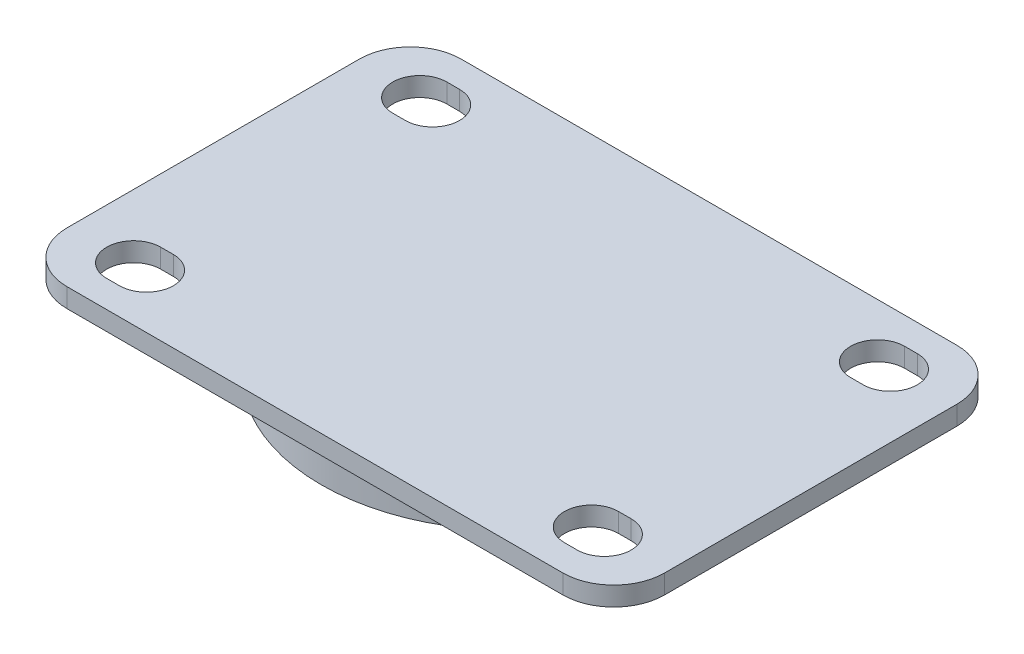
ISO-10303-21;
HEADER;
FILE_DESCRIPTION(('STEP AP214'),'2;1');
FILE_NAME('part.step','',(''),(''),'','','');
FILE_SCHEMA(('AUTOMOTIVE_DESIGN { 1 0 10303 214 1 1 1 1 }'));
ENDSEC;
DATA;
#1=APPLICATION_CONTEXT('core data for automotive mechanical design processes');
#2=APPLICATION_PROTOCOL_DEFINITION('international standard','automotive_design',2000,#1);
#3=PRODUCT_CONTEXT('',#1,'mechanical');
#4=PRODUCT('Part','Part','',(#3));
#5=PRODUCT_RELATED_PRODUCT_CATEGORY('part','',(#4));
#6=PRODUCT_DEFINITION_FORMATION('','',#4);
#7=PRODUCT_DEFINITION_CONTEXT('part definition',#1,'design');
#8=PRODUCT_DEFINITION('design','',#6,#7);
#9=PRODUCT_DEFINITION_SHAPE('','',#8);
#10=(LENGTH_UNIT() NAMED_UNIT(*) SI_UNIT(.MILLI.,.METRE.));
#11=(NAMED_UNIT(*) PLANE_ANGLE_UNIT() SI_UNIT($,.RADIAN.));
#12=(NAMED_UNIT(*) SI_UNIT($,.STERADIAN.) SOLID_ANGLE_UNIT());
#13=UNCERTAINTY_MEASURE_WITH_UNIT(LENGTH_MEASURE(1.E-05),#10,'distance_accuracy_value','');
#14=(GEOMETRIC_REPRESENTATION_CONTEXT(3) GLOBAL_UNCERTAINTY_ASSIGNED_CONTEXT((#13)) GLOBAL_UNIT_ASSIGNED_CONTEXT((#10,
#11,#12)) REPRESENTATION_CONTEXT('',''));
#15=CARTESIAN_POINT('',(0.,0.,0.));
#16=DIRECTION('',(0.,0.,1.));
#17=DIRECTION('',(1.,0.,0.));
#18=AXIS2_PLACEMENT_3D('',#15,#16,#17);
#19=CARTESIAN_POINT('',(0.,3.,0.));
#20=DIRECTION('',(0.,1.,0.));
#21=DIRECTION('',(0.,0.,1.));
#22=AXIS2_PLACEMENT_3D('',#19,#20,#21);
#23=PLANE('',#22);
#24=DIRECTION('',(0.,0.,1.));
#25=VECTOR('',#24,1.);
#26=CARTESIAN_POINT('',(-47.,3.,31.));
#27=LINE('',#26,#25);
#28=CARTESIAN_POINT('',(-47.,3.,-23.));
#29=VERTEX_POINT('',#28);
#30=CARTESIAN_POINT('',(-47.,3.,23.));
#31=VERTEX_POINT('',#30);
#32=EDGE_CURVE('E334',#29,#31,#27,.T.);
#33=ORIENTED_EDGE('',*,*,#32,.T.);
#34=CARTESIAN_POINT('',(-39.,3.,23.));
#35=DIRECTION('',(0.,1.,0.));
#36=DIRECTION('',(0.,0.,1.));
#37=AXIS2_PLACEMENT_3D('',#34,#35,#36);
#38=CIRCLE('',#37,8.);
#39=CARTESIAN_POINT('',(-39.,3.,31.));
#40=VERTEX_POINT('',#39);
#41=EDGE_CURVE('E377',#31,#40,#38,.T.);
#42=ORIENTED_EDGE('',*,*,#41,.T.);
#43=DIRECTION('',(1.,0.,0.));
#44=VECTOR('',#43,1.);
#45=CARTESIAN_POINT('',(47.,3.,31.));
#46=LINE('',#45,#44);
#47=CARTESIAN_POINT('',(39.,3.,31.));
#48=VERTEX_POINT('',#47);
#49=EDGE_CURVE('E337',#40,#48,#46,.T.);
#50=ORIENTED_EDGE('',*,*,#49,.T.);
#51=CARTESIAN_POINT('',(39.,3.,23.));
#52=DIRECTION('',(0.,1.,0.));
#53=DIRECTION('',(0.,0.,1.));
#54=AXIS2_PLACEMENT_3D('',#51,#52,#53);
#55=CIRCLE('',#54,8.);
#56=CARTESIAN_POINT('',(47.,3.,23.));
#57=VERTEX_POINT('',#56);
#58=EDGE_CURVE('E375',#48,#57,#55,.T.);
#59=ORIENTED_EDGE('',*,*,#58,.T.);
#60=DIRECTION('',(0.,0.,-1.));
#61=VECTOR('',#60,1.);
#62=CARTESIAN_POINT('',(47.,3.,31.));
#63=LINE('',#62,#61);
#64=CARTESIAN_POINT('',(47.,3.,-23.));
#65=VERTEX_POINT('',#64);
#66=EDGE_CURVE('E341',#57,#65,#63,.T.);
#67=ORIENTED_EDGE('',*,*,#66,.T.);
#68=CARTESIAN_POINT('',(39.,3.,-23.));
#69=DIRECTION('',(0.,1.,0.));
#70=DIRECTION('',(0.,0.,1.));
#71=AXIS2_PLACEMENT_3D('',#68,#69,#70);
#72=CIRCLE('',#71,8.);
#73=CARTESIAN_POINT('',(39.,3.,-31.));
#74=VERTEX_POINT('',#73);
#75=EDGE_CURVE('E56',#65,#74,#72,.T.);
#76=ORIENTED_EDGE('',*,*,#75,.T.);
#77=DIRECTION('',(-1.,0.,0.));
#78=VECTOR('',#77,1.);
#79=CARTESIAN_POINT('',(47.,3.,-31.));
#80=LINE('',#79,#78);
#81=CARTESIAN_POINT('',(-39.,3.,-31.));
#82=VERTEX_POINT('',#81);
#83=EDGE_CURVE('E343',#74,#82,#80,.T.);
#84=ORIENTED_EDGE('',*,*,#83,.T.);
#85=CARTESIAN_POINT('',(-39.,3.,-23.));
#86=DIRECTION('',(0.,1.,0.));
#87=DIRECTION('',(0.,0.,1.));
#88=AXIS2_PLACEMENT_3D('',#85,#86,#87);
#89=CIRCLE('',#88,8.);
#90=EDGE_CURVE('E372',#82,#29,#89,.T.);
#91=ORIENTED_EDGE('',*,*,#90,.T.);
#92=EDGE_LOOP('',(#33,#42,#50,#59,#67,#76,#84,#91));
#93=FACE_BOUND('',#92,.T.);
#94=DIRECTION('',(1.,0.,0.));
#95=VECTOR('',#94,1.);
#96=CARTESIAN_POINT('',(-37.,3.,-18.25));
#97=LINE('',#96,#95);
#98=CARTESIAN_POINT('',(-37.,3.,-18.25));
#99=VERTEX_POINT('',#98);
#100=CARTESIAN_POINT('',(-35.,3.,-18.25));
#101=VERTEX_POINT('',#100);
#102=EDGE_CURVE('E305',#99,#101,#97,.T.);
#103=ORIENTED_EDGE('',*,*,#102,.F.);
#104=CARTESIAN_POINT('',(-37.,3.,-22.5));
#105=DIRECTION('',(0.,1.,0.));
#106=DIRECTION('',(0.,0.,1.));
#107=AXIS2_PLACEMENT_3D('',#104,#105,#106);
#108=CIRCLE('',#107,4.25);
#109=CARTESIAN_POINT('',(-37.,3.,-26.75));
#110=VERTEX_POINT('',#109);
#111=EDGE_CURVE('E303',#110,#99,#108,.T.);
#112=ORIENTED_EDGE('',*,*,#111,.F.);
#113=DIRECTION('',(-1.,0.,0.));
#114=VECTOR('',#113,1.);
#115=CARTESIAN_POINT('',(-37.,3.,-26.75));
#116=LINE('',#115,#114);
#117=CARTESIAN_POINT('',(-35.,3.,-26.75));
#118=VERTEX_POINT('',#117);
#119=EDGE_CURVE('E311',#118,#110,#116,.T.);
#120=ORIENTED_EDGE('',*,*,#119,.F.);
#121=CARTESIAN_POINT('',(-35.,3.,-22.5));
#122=DIRECTION('',(0.,1.,0.));
#123=DIRECTION('',(0.,0.,1.));
#124=AXIS2_PLACEMENT_3D('',#121,#122,#123);
#125=CIRCLE('',#124,4.25);
#126=EDGE_CURVE('E308',#101,#118,#125,.T.);
#127=ORIENTED_EDGE('',*,*,#126,.F.);
#128=EDGE_LOOP('',(#103,#112,#120,#127));
#129=FACE_BOUND('',#128,.T.);
#130=DIRECTION('',(-1.,0.,0.));
#131=VECTOR('',#130,1.);
#132=CARTESIAN_POINT('',(37.,3.,-26.75));
#133=LINE('',#132,#131);
#134=CARTESIAN_POINT('',(37.,3.,-26.75));
#135=VERTEX_POINT('',#134);
#136=CARTESIAN_POINT('',(35.,3.,-26.75));
#137=VERTEX_POINT('',#136);
#138=EDGE_CURVE('E274',#135,#137,#133,.T.);
#139=ORIENTED_EDGE('',*,*,#138,.F.);
#140=CARTESIAN_POINT('',(37.,3.,-22.5));
#141=DIRECTION('',(0.,1.,0.));
#142=DIRECTION('',(0.,0.,-1.));
#143=AXIS2_PLACEMENT_3D('',#140,#141,#142);
#144=CIRCLE('',#143,4.24999999999999);
#145=CARTESIAN_POINT('',(37.,3.,-18.25));
#146=VERTEX_POINT('',#145);
#147=EDGE_CURVE('E272',#146,#135,#144,.T.);
#148=ORIENTED_EDGE('',*,*,#147,.F.);
#149=DIRECTION('',(1.,0.,0.));
#150=VECTOR('',#149,1.);
#151=CARTESIAN_POINT('',(37.,3.,-18.25));
#152=LINE('',#151,#150);
#153=CARTESIAN_POINT('',(35.,3.,-18.25));
#154=VERTEX_POINT('',#153);
#155=EDGE_CURVE('E280',#154,#146,#152,.T.);
#156=ORIENTED_EDGE('',*,*,#155,.F.);
#157=CARTESIAN_POINT('',(35.,3.,-22.5));
#158=DIRECTION('',(0.,1.,0.));
#159=DIRECTION('',(0.,0.,-1.));
#160=AXIS2_PLACEMENT_3D('',#157,#158,#159);
#161=CIRCLE('',#160,4.25);
#162=EDGE_CURVE('E277',#137,#154,#161,.T.);
#163=ORIENTED_EDGE('',*,*,#162,.F.);
#164=EDGE_LOOP('',(#139,#148,#156,#163));
#165=FACE_BOUND('',#164,.T.);
#166=DIRECTION('',(-1.,0.,0.));
#167=VECTOR('',#166,1.);
#168=CARTESIAN_POINT('',(37.,3.,18.25));
#169=LINE('',#168,#167);
#170=CARTESIAN_POINT('',(37.,3.,18.25));
#171=VERTEX_POINT('',#170);
#172=CARTESIAN_POINT('',(35.,3.,18.25));
#173=VERTEX_POINT('',#172);
#174=EDGE_CURVE('E243',#171,#173,#169,.T.);
#175=ORIENTED_EDGE('',*,*,#174,.F.);
#176=CARTESIAN_POINT('',(37.,3.,22.5));
#177=DIRECTION('',(0.,1.,0.));
#178=DIRECTION('',(0.,0.,1.));
#179=AXIS2_PLACEMENT_3D('',#176,#177,#178);
#180=CIRCLE('',#179,4.25);
#181=CARTESIAN_POINT('',(37.,3.,26.75));
#182=VERTEX_POINT('',#181);
#183=EDGE_CURVE('E241',#182,#171,#180,.T.);
#184=ORIENTED_EDGE('',*,*,#183,.F.);
#185=DIRECTION('',(1.,0.,0.));
#186=VECTOR('',#185,1.);
#187=CARTESIAN_POINT('',(37.,3.,26.75));
#188=LINE('',#187,#186);
#189=CARTESIAN_POINT('',(35.,3.,26.75));
#190=VERTEX_POINT('',#189);
#191=EDGE_CURVE('E249',#190,#182,#188,.T.);
#192=ORIENTED_EDGE('',*,*,#191,.F.);
#193=CARTESIAN_POINT('',(35.,3.,22.5));
#194=DIRECTION('',(0.,1.,0.));
#195=DIRECTION('',(0.,0.,1.));
#196=AXIS2_PLACEMENT_3D('',#193,#194,#195);
#197=CIRCLE('',#196,4.24999999999999);
#198=EDGE_CURVE('E246',#173,#190,#197,.T.);
#199=ORIENTED_EDGE('',*,*,#198,.F.);
#200=EDGE_LOOP('',(#175,#184,#192,#199));
#201=FACE_BOUND('',#200,.T.);
#202=DIRECTION('',(1.,0.,0.));
#203=VECTOR('',#202,1.);
#204=CARTESIAN_POINT('',(-37.,3.,26.75));
#205=LINE('',#204,#203);
#206=CARTESIAN_POINT('',(-37.,3.,26.75));
#207=VERTEX_POINT('',#206);
#208=CARTESIAN_POINT('',(-35.,3.,26.75));
#209=VERTEX_POINT('',#208);
#210=EDGE_CURVE('E208',#207,#209,#205,.T.);
#211=ORIENTED_EDGE('',*,*,#210,.F.);
#212=CARTESIAN_POINT('',(-37.,3.,22.5));
#213=DIRECTION('',(0.,1.,0.));
#214=DIRECTION('',(0.,0.,-1.));
#215=AXIS2_PLACEMENT_3D('',#212,#213,#214);
#216=CIRCLE('',#215,4.25);
#217=CARTESIAN_POINT('',(-37.,3.,18.25));
#218=VERTEX_POINT('',#217);
#219=EDGE_CURVE('E198',#218,#207,#216,.T.);
#220=ORIENTED_EDGE('',*,*,#219,.F.);
#221=DIRECTION('',(-1.,0.,0.));
#222=VECTOR('',#221,1.);
#223=CARTESIAN_POINT('',(-37.,3.,18.25));
#224=LINE('',#223,#222);
#225=CARTESIAN_POINT('',(-35.,3.,18.25));
#226=VERTEX_POINT('',#225);
#227=EDGE_CURVE('E223',#226,#218,#224,.T.);
#228=ORIENTED_EDGE('',*,*,#227,.F.);
#229=CARTESIAN_POINT('',(-35.,3.,22.5));
#230=DIRECTION('',(0.,1.,0.));
#231=DIRECTION('',(0.,0.,-1.));
#232=AXIS2_PLACEMENT_3D('',#229,#230,#231);
#233=CIRCLE('',#232,4.25);
#234=EDGE_CURVE('E221',#209,#226,#233,.T.);
#235=ORIENTED_EDGE('',*,*,#234,.F.);
#236=EDGE_LOOP('',(#211,#220,#228,#235));
#237=FACE_BOUND('',#236,.T.);
#238=ADVANCED_FACE('F34',(#93,#129,#165,#201,#237),#23,.T.);
#239=CARTESIAN_POINT('',(0.,0.,0.));
#240=DIRECTION('',(0.,1.,0.));
#241=DIRECTION('',(0.,0.,1.));
#242=AXIS2_PLACEMENT_3D('',#239,#240,#241);
#243=PLANE('',#242);
#244=CARTESIAN_POINT('',(0.,0.,0.));
#245=DIRECTION('',(0.,1.,0.));
#246=DIRECTION('',(0.,0.,1.));
#247=AXIS2_PLACEMENT_3D('',#244,#245,#246);
#248=CIRCLE('',#247,30.);
#249=CARTESIAN_POINT('',(0.,0.,30.));
#250=VERTEX_POINT('',#249);
#251=EDGE_CURVE('E11',#250,#250,#248,.F.);
#252=ORIENTED_EDGE('',*,*,#251,.F.);
#253=EDGE_LOOP('',(#252));
#254=FACE_BOUND('',#253,.T.);
#255=CARTESIAN_POINT('',(37.,0.,22.5));
#256=DIRECTION('',(0.,1.,0.));
#257=DIRECTION('',(0.,0.,1.));
#258=AXIS2_PLACEMENT_3D('',#255,#256,#257);
#259=CIRCLE('',#258,4.25);
#260=CARTESIAN_POINT('',(37.,0.,26.75));
#261=VERTEX_POINT('',#260);
#262=CARTESIAN_POINT('',(37.,0.,18.25));
#263=VERTEX_POINT('',#262);
#264=EDGE_CURVE('E216',#261,#263,#259,.T.);
#265=ORIENTED_EDGE('',*,*,#264,.T.);
#266=DIRECTION('',(-1.,0.,0.));
#267=VECTOR('',#266,1.);
#268=CARTESIAN_POINT('',(37.,0.,18.25));
#269=LINE('',#268,#267);
#270=CARTESIAN_POINT('',(35.,0.,18.25));
#271=VERTEX_POINT('',#270);
#272=EDGE_CURVE('E254',#263,#271,#269,.T.);
#273=ORIENTED_EDGE('',*,*,#272,.T.);
#274=CARTESIAN_POINT('',(35.,0.,22.5));
#275=DIRECTION('',(0.,1.,0.));
#276=DIRECTION('',(0.,0.,1.));
#277=AXIS2_PLACEMENT_3D('',#274,#275,#276);
#278=CIRCLE('',#277,4.24999999999999);
#279=CARTESIAN_POINT('',(35.,0.,26.75));
#280=VERTEX_POINT('',#279);
#281=EDGE_CURVE('E257',#271,#280,#278,.T.);
#282=ORIENTED_EDGE('',*,*,#281,.T.);
#283=DIRECTION('',(1.,0.,0.));
#284=VECTOR('',#283,1.);
#285=CARTESIAN_POINT('',(37.,0.,26.75));
#286=LINE('',#285,#284);
#287=EDGE_CURVE('E244',#280,#261,#286,.T.);
#288=ORIENTED_EDGE('',*,*,#287,.T.);
#289=EDGE_LOOP('',(#265,#273,#282,#288));
#290=FACE_BOUND('',#289,.T.);
#291=CARTESIAN_POINT('',(-37.,0.,-22.5));
#292=DIRECTION('',(0.,1.,0.));
#293=DIRECTION('',(0.,0.,1.));
#294=AXIS2_PLACEMENT_3D('',#291,#292,#293);
#295=CIRCLE('',#294,4.25);
#296=CARTESIAN_POINT('',(-37.,0.,-26.75));
#297=VERTEX_POINT('',#296);
#298=CARTESIAN_POINT('',(-37.,0.,-18.25));
#299=VERTEX_POINT('',#298);
#300=EDGE_CURVE('E302',#297,#299,#295,.T.);
#301=ORIENTED_EDGE('',*,*,#300,.T.);
#302=DIRECTION('',(1.,0.,0.));
#303=VECTOR('',#302,1.);
#304=CARTESIAN_POINT('',(-37.,0.,-18.25));
#305=LINE('',#304,#303);
#306=CARTESIAN_POINT('',(-35.,0.,-18.25));
#307=VERTEX_POINT('',#306);
#308=EDGE_CURVE('E316',#299,#307,#305,.T.);
#309=ORIENTED_EDGE('',*,*,#308,.T.);
#310=CARTESIAN_POINT('',(-35.,0.,-22.5));
#311=DIRECTION('',(0.,1.,0.));
#312=DIRECTION('',(0.,0.,1.));
#313=AXIS2_PLACEMENT_3D('',#310,#311,#312);
#314=CIRCLE('',#313,4.25);
#315=CARTESIAN_POINT('',(-35.,0.,-26.75));
#316=VERTEX_POINT('',#315);
#317=EDGE_CURVE('E319',#307,#316,#314,.T.);
#318=ORIENTED_EDGE('',*,*,#317,.T.);
#319=DIRECTION('',(-1.,0.,0.));
#320=VECTOR('',#319,1.);
#321=CARTESIAN_POINT('',(-37.,0.,-26.75));
#322=LINE('',#321,#320);
#323=EDGE_CURVE('E306',#316,#297,#322,.T.);
#324=ORIENTED_EDGE('',*,*,#323,.T.);
#325=EDGE_LOOP('',(#301,#309,#318,#324));
#326=FACE_BOUND('',#325,.T.);
#327=DIRECTION('',(1.,0.,0.));
#328=VECTOR('',#327,1.);
#329=CARTESIAN_POINT('',(47.,0.,31.));
#330=LINE('',#329,#328);
#331=CARTESIAN_POINT('',(-39.,0.,31.));
#332=VERTEX_POINT('',#331);
#333=CARTESIAN_POINT('',(39.,0.,31.));
#334=VERTEX_POINT('',#333);
#335=EDGE_CURVE('E348',#332,#334,#330,.T.);
#336=ORIENTED_EDGE('',*,*,#335,.F.);
#337=CARTESIAN_POINT('',(-39.,0.,23.));
#338=DIRECTION('',(0.,1.,0.));
#339=DIRECTION('',(0.,0.,1.));
#340=AXIS2_PLACEMENT_3D('',#337,#338,#339);
#341=CIRCLE('',#340,8.);
#342=CARTESIAN_POINT('',(-47.,0.,23.));
#343=VERTEX_POINT('',#342);
#344=EDGE_CURVE('E365',#332,#343,#341,.F.);
#345=ORIENTED_EDGE('',*,*,#344,.T.);
#346=DIRECTION('',(0.,0.,1.));
#347=VECTOR('',#346,1.);
#348=CARTESIAN_POINT('',(-47.,0.,31.));
#349=LINE('',#348,#347);
#350=CARTESIAN_POINT('',(-47.,0.,-23.));
#351=VERTEX_POINT('',#350);
#352=EDGE_CURVE('E333',#351,#343,#349,.T.);
#353=ORIENTED_EDGE('',*,*,#352,.F.);
#354=CARTESIAN_POINT('',(-39.,0.,-23.));
#355=DIRECTION('',(0.,1.,0.));
#356=DIRECTION('',(0.,0.,1.));
#357=AXIS2_PLACEMENT_3D('',#354,#355,#356);
#358=CIRCLE('',#357,8.);
#359=CARTESIAN_POINT('',(-39.,0.,-31.));
#360=VERTEX_POINT('',#359);
#361=EDGE_CURVE('E359',#351,#360,#358,.F.);
#362=ORIENTED_EDGE('',*,*,#361,.T.);
#363=DIRECTION('',(-1.,0.,0.));
#364=VECTOR('',#363,1.);
#365=CARTESIAN_POINT('',(47.,0.,-31.));
#366=LINE('',#365,#364);
#367=CARTESIAN_POINT('',(39.,0.,-31.));
#368=VERTEX_POINT('',#367);
#369=EDGE_CURVE('E338',#368,#360,#366,.T.);
#370=ORIENTED_EDGE('',*,*,#369,.F.);
#371=CARTESIAN_POINT('',(39.,0.,-23.));
#372=DIRECTION('',(0.,1.,0.));
#373=DIRECTION('',(0.,0.,1.));
#374=AXIS2_PLACEMENT_3D('',#371,#372,#373);
#375=CIRCLE('',#374,8.);
#376=CARTESIAN_POINT('',(47.,0.,-23.));
#377=VERTEX_POINT('',#376);
#378=EDGE_CURVE('E361',#368,#377,#375,.F.);
#379=ORIENTED_EDGE('',*,*,#378,.T.);
#380=DIRECTION('',(0.,0.,-1.));
#381=VECTOR('',#380,1.);
#382=CARTESIAN_POINT('',(47.,0.,31.));
#383=LINE('',#382,#381);
#384=CARTESIAN_POINT('',(47.,0.,23.));
#385=VERTEX_POINT('',#384);
#386=EDGE_CURVE('E351',#385,#377,#383,.T.);
#387=ORIENTED_EDGE('',*,*,#386,.F.);
#388=CARTESIAN_POINT('',(39.,0.,23.));
#389=DIRECTION('',(0.,1.,0.));
#390=DIRECTION('',(0.,0.,1.));
#391=AXIS2_PLACEMENT_3D('',#388,#389,#390);
#392=CIRCLE('',#391,8.);
#393=EDGE_CURVE('E363',#385,#334,#392,.F.);
#394=ORIENTED_EDGE('',*,*,#393,.T.);
#395=EDGE_LOOP('',(#336,#345,#353,#362,#370,#379,#387,#394));
#396=FACE_BOUND('',#395,.T.);
#397=CARTESIAN_POINT('',(37.,0.,-22.5));
#398=DIRECTION('',(0.,1.,0.));
#399=DIRECTION('',(0.,0.,-1.));
#400=AXIS2_PLACEMENT_3D('',#397,#398,#399);
#401=CIRCLE('',#400,4.24999999999999);
#402=CARTESIAN_POINT('',(37.,0.,-18.25));
#403=VERTEX_POINT('',#402);
#404=CARTESIAN_POINT('',(37.,0.,-26.75));
#405=VERTEX_POINT('',#404);
#406=EDGE_CURVE('E271',#403,#405,#401,.T.);
#407=ORIENTED_EDGE('',*,*,#406,.T.);
#408=DIRECTION('',(-1.,0.,0.));
#409=VECTOR('',#408,1.);
#410=CARTESIAN_POINT('',(37.,0.,-26.75));
#411=LINE('',#410,#409);
#412=CARTESIAN_POINT('',(35.,0.,-26.75));
#413=VERTEX_POINT('',#412);
#414=EDGE_CURVE('E285',#405,#413,#411,.T.);
#415=ORIENTED_EDGE('',*,*,#414,.T.);
#416=CARTESIAN_POINT('',(35.,0.,-22.5));
#417=DIRECTION('',(0.,1.,0.));
#418=DIRECTION('',(0.,0.,-1.));
#419=AXIS2_PLACEMENT_3D('',#416,#417,#418);
#420=CIRCLE('',#419,4.25);
#421=CARTESIAN_POINT('',(35.,0.,-18.25));
#422=VERTEX_POINT('',#421);
#423=EDGE_CURVE('E288',#413,#422,#420,.T.);
#424=ORIENTED_EDGE('',*,*,#423,.T.);
#425=DIRECTION('',(1.,0.,0.));
#426=VECTOR('',#425,1.);
#427=CARTESIAN_POINT('',(37.,0.,-18.25));
#428=LINE('',#427,#426);
#429=EDGE_CURVE('E275',#422,#403,#428,.T.);
#430=ORIENTED_EDGE('',*,*,#429,.T.);
#431=EDGE_LOOP('',(#407,#415,#424,#430));
#432=FACE_BOUND('',#431,.T.);
#433=CARTESIAN_POINT('',(-37.,0.,22.5));
#434=DIRECTION('',(0.,1.,0.));
#435=DIRECTION('',(0.,0.,-1.));
#436=AXIS2_PLACEMENT_3D('',#433,#434,#435);
#437=CIRCLE('',#436,4.25);
#438=CARTESIAN_POINT('',(-37.,0.,18.25));
#439=VERTEX_POINT('',#438);
#440=CARTESIAN_POINT('',(-37.,0.,26.75));
#441=VERTEX_POINT('',#440);
#442=EDGE_CURVE('E228',#439,#441,#437,.T.);
#443=ORIENTED_EDGE('',*,*,#442,.T.);
#444=DIRECTION('',(1.,0.,0.));
#445=VECTOR('',#444,1.);
#446=CARTESIAN_POINT('',(-37.,0.,26.75));
#447=LINE('',#446,#445);
#448=CARTESIAN_POINT('',(-35.,0.,26.75));
#449=VERTEX_POINT('',#448);
#450=EDGE_CURVE('E215',#441,#449,#447,.T.);
#451=ORIENTED_EDGE('',*,*,#450,.T.);
#452=CARTESIAN_POINT('',(-35.,0.,22.5));
#453=DIRECTION('',(0.,1.,0.));
#454=DIRECTION('',(0.,0.,-1.));
#455=AXIS2_PLACEMENT_3D('',#452,#453,#454);
#456=CIRCLE('',#455,4.25);
#457=CARTESIAN_POINT('',(-35.,0.,18.25));
#458=VERTEX_POINT('',#457);
#459=EDGE_CURVE('E232',#449,#458,#456,.T.);
#460=ORIENTED_EDGE('',*,*,#459,.T.);
#461=DIRECTION('',(-1.,0.,0.));
#462=VECTOR('',#461,1.);
#463=CARTESIAN_POINT('',(-37.,0.,18.25));
#464=LINE('',#463,#462);
#465=EDGE_CURVE('E209',#458,#439,#464,.T.);
#466=ORIENTED_EDGE('',*,*,#465,.T.);
#467=EDGE_LOOP('',(#443,#451,#460,#466));
#468=FACE_BOUND('',#467,.T.);
#469=ADVANCED_FACE('F391',(#254,#290,#326,#396,#432,#468),#243,.F.);
#470=CARTESIAN_POINT('',(-47.,3.,31.));
#471=DIRECTION('',(1.,0.,0.));
#472=DIRECTION('',(0.,0.,-1.));
#473=AXIS2_PLACEMENT_3D('',#470,#471,#472);
#474=PLANE('',#473);
#475=ORIENTED_EDGE('',*,*,#352,.T.);
#476=DIRECTION('',(0.,-1.,0.));
#477=VECTOR('',#476,1.);
#478=CARTESIAN_POINT('',(-47.,3.,23.));
#479=LINE('',#478,#477);
#480=EDGE_CURVE('E370',#343,#31,#479,.F.);
#481=ORIENTED_EDGE('',*,*,#480,.T.);
#482=ORIENTED_EDGE('',*,*,#32,.F.);
#483=DIRECTION('',(0.,-1.,0.));
#484=VECTOR('',#483,1.);
#485=CARTESIAN_POINT('',(-47.,3.,-23.));
#486=LINE('',#485,#484);
#487=EDGE_CURVE('E367',#29,#351,#486,.T.);
#488=ORIENTED_EDGE('',*,*,#487,.T.);
#489=EDGE_LOOP('',(#475,#481,#482,#488));
#490=FACE_BOUND('',#489,.T.);
#491=ADVANCED_FACE('F400',(#490),#474,.F.);
#492=CARTESIAN_POINT('',(47.,3.,31.));
#493=DIRECTION('',(0.,0.,-1.));
#494=DIRECTION('',(-1.,0.,0.));
#495=AXIS2_PLACEMENT_3D('',#492,#493,#494);
#496=PLANE('',#495);
#497=ORIENTED_EDGE('',*,*,#49,.F.);
#498=DIRECTION('',(0.,-1.,0.));
#499=VECTOR('',#498,1.);
#500=CARTESIAN_POINT('',(-39.,3.,31.));
#501=LINE('',#500,#499);
#502=EDGE_CURVE('E356',#40,#332,#501,.T.);
#503=ORIENTED_EDGE('',*,*,#502,.T.);
#504=ORIENTED_EDGE('',*,*,#335,.T.);
#505=DIRECTION('',(0.,-1.,0.));
#506=VECTOR('',#505,1.);
#507=CARTESIAN_POINT('',(39.,3.,31.));
#508=LINE('',#507,#506);
#509=EDGE_CURVE('E345',#334,#48,#508,.F.);
#510=ORIENTED_EDGE('',*,*,#509,.T.);
#511=EDGE_LOOP('',(#497,#503,#504,#510));
#512=FACE_BOUND('',#511,.T.);
#513=ADVANCED_FACE('F409',(#512),#496,.F.);
#514=CARTESIAN_POINT('',(47.,3.,31.));
#515=DIRECTION('',(-1.,0.,0.));
#516=DIRECTION('',(0.,0.,1.));
#517=AXIS2_PLACEMENT_3D('',#514,#515,#516);
#518=PLANE('',#517);
#519=ORIENTED_EDGE('',*,*,#66,.F.);
#520=DIRECTION('',(0.,-1.,0.));
#521=VECTOR('',#520,1.);
#522=CARTESIAN_POINT('',(47.,3.,23.));
#523=LINE('',#522,#521);
#524=EDGE_CURVE('E381',#57,#385,#523,.T.);
#525=ORIENTED_EDGE('',*,*,#524,.T.);
#526=ORIENTED_EDGE('',*,*,#386,.T.);
#527=DIRECTION('',(0.,-1.,0.));
#528=VECTOR('',#527,1.);
#529=CARTESIAN_POINT('',(47.,3.,-23.));
#530=LINE('',#529,#528);
#531=EDGE_CURVE('E379',#377,#65,#530,.F.);
#532=ORIENTED_EDGE('',*,*,#531,.T.);
#533=EDGE_LOOP('',(#519,#525,#526,#532));
#534=FACE_BOUND('',#533,.T.);
#535=ADVANCED_FACE('F417',(#534),#518,.F.);
#536=CARTESIAN_POINT('',(47.,3.,-31.));
#537=DIRECTION('',(0.,0.,1.));
#538=DIRECTION('',(1.,0.,0.));
#539=AXIS2_PLACEMENT_3D('',#536,#537,#538);
#540=PLANE('',#539);
#541=ORIENTED_EDGE('',*,*,#83,.F.);
#542=DIRECTION('',(0.,-1.,0.));
#543=VECTOR('',#542,1.);
#544=CARTESIAN_POINT('',(39.,3.,-31.));
#545=LINE('',#544,#543);
#546=EDGE_CURVE('E42',#74,#368,#545,.T.);
#547=ORIENTED_EDGE('',*,*,#546,.T.);
#548=ORIENTED_EDGE('',*,*,#369,.T.);
#549=DIRECTION('',(0.,-1.,0.));
#550=VECTOR('',#549,1.);
#551=CARTESIAN_POINT('',(-39.,3.,-31.));
#552=LINE('',#551,#550);
#553=EDGE_CURVE('E49',#360,#82,#552,.F.);
#554=ORIENTED_EDGE('',*,*,#553,.T.);
#555=EDGE_LOOP('',(#541,#547,#548,#554));
#556=FACE_BOUND('',#555,.T.);
#557=ADVANCED_FACE('F387',(#556),#540,.F.);
#558=CARTESIAN_POINT('',(-37.,3.,-22.5));
#559=DIRECTION('',(0.,-1.,0.));
#560=DIRECTION('',(0.,0.,-1.));
#561=AXIS2_PLACEMENT_3D('',#558,#559,#560);
#562=CYLINDRICAL_SURFACE('',#561,4.25);
#563=ORIENTED_EDGE('',*,*,#300,.F.);
#564=DIRECTION('',(0.,-1.,0.));
#565=VECTOR('',#564,1.);
#566=CARTESIAN_POINT('',(-37.,3.,-26.75));
#567=LINE('',#566,#565);
#568=EDGE_CURVE('E313',#110,#297,#567,.T.);
#569=ORIENTED_EDGE('',*,*,#568,.F.);
#570=ORIENTED_EDGE('',*,*,#111,.T.);
#571=DIRECTION('',(0.,-1.,0.));
#572=VECTOR('',#571,1.);
#573=CARTESIAN_POINT('',(-37.,3.,-18.25));
#574=LINE('',#573,#572);
#575=EDGE_CURVE('E330',#99,#299,#574,.T.);
#576=ORIENTED_EDGE('',*,*,#575,.T.);
#577=EDGE_LOOP('',(#563,#569,#570,#576));
#578=FACE_BOUND('',#577,.T.);
#579=ADVANCED_FACE('F435',(#578),#562,.F.);
#580=CARTESIAN_POINT('',(-37.,3.,-18.25));
#581=DIRECTION('',(0.,0.,-1.));
#582=DIRECTION('',(-1.,0.,0.));
#583=AXIS2_PLACEMENT_3D('',#580,#581,#582);
#584=PLANE('',#583);
#585=ORIENTED_EDGE('',*,*,#308,.F.);
#586=ORIENTED_EDGE('',*,*,#575,.F.);
#587=ORIENTED_EDGE('',*,*,#102,.T.);
#588=DIRECTION('',(0.,-1.,0.));
#589=VECTOR('',#588,1.);
#590=CARTESIAN_POINT('',(-35.,3.,-18.25));
#591=LINE('',#590,#589);
#592=EDGE_CURVE('E328',#101,#307,#591,.T.);
#593=ORIENTED_EDGE('',*,*,#592,.T.);
#594=EDGE_LOOP('',(#585,#586,#587,#593));
#595=FACE_BOUND('',#594,.T.);
#596=ADVANCED_FACE('F505',(#595),#584,.T.);
#597=CARTESIAN_POINT('',(-35.,3.,-22.5));
#598=DIRECTION('',(0.,-1.,0.));
#599=DIRECTION('',(0.,0.,-1.));
#600=AXIS2_PLACEMENT_3D('',#597,#598,#599);
#601=CYLINDRICAL_SURFACE('',#600,4.25);
#602=ORIENTED_EDGE('',*,*,#317,.F.);
#603=ORIENTED_EDGE('',*,*,#592,.F.);
#604=ORIENTED_EDGE('',*,*,#126,.T.);
#605=DIRECTION('',(0.,-1.,0.));
#606=VECTOR('',#605,1.);
#607=CARTESIAN_POINT('',(-35.,3.,-26.75));
#608=LINE('',#607,#606);
#609=EDGE_CURVE('E326',#118,#316,#608,.T.);
#610=ORIENTED_EDGE('',*,*,#609,.T.);
#611=EDGE_LOOP('',(#602,#603,#604,#610));
#612=FACE_BOUND('',#611,.T.);
#613=ADVANCED_FACE('F502',(#612),#601,.F.);
#614=CARTESIAN_POINT('',(-37.,3.,-26.75));
#615=DIRECTION('',(0.,0.,1.));
#616=DIRECTION('',(1.,0.,0.));
#617=AXIS2_PLACEMENT_3D('',#614,#615,#616);
#618=PLANE('',#617);
#619=ORIENTED_EDGE('',*,*,#323,.F.);
#620=ORIENTED_EDGE('',*,*,#609,.F.);
#621=ORIENTED_EDGE('',*,*,#119,.T.);
#622=ORIENTED_EDGE('',*,*,#568,.T.);
#623=EDGE_LOOP('',(#619,#620,#621,#622));
#624=FACE_BOUND('',#623,.T.);
#625=ADVANCED_FACE('F498',(#624),#618,.T.);
#626=CARTESIAN_POINT('',(37.,3.,-22.5));
#627=DIRECTION('',(0.,-1.,0.));
#628=DIRECTION('',(0.,0.,-1.));
#629=AXIS2_PLACEMENT_3D('',#626,#627,#628);
#630=CYLINDRICAL_SURFACE('',#629,4.24999999999999);
#631=ORIENTED_EDGE('',*,*,#406,.F.);
#632=DIRECTION('',(0.,-1.,0.));
#633=VECTOR('',#632,1.);
#634=CARTESIAN_POINT('',(37.,3.,-18.25));
#635=LINE('',#634,#633);
#636=EDGE_CURVE('E282',#146,#403,#635,.T.);
#637=ORIENTED_EDGE('',*,*,#636,.F.);
#638=ORIENTED_EDGE('',*,*,#147,.T.);
#639=DIRECTION('',(0.,-1.,0.));
#640=VECTOR('',#639,1.);
#641=CARTESIAN_POINT('',(37.,3.,-26.75));
#642=LINE('',#641,#640);
#643=EDGE_CURVE('E299',#135,#405,#642,.T.);
#644=ORIENTED_EDGE('',*,*,#643,.T.);
#645=EDGE_LOOP('',(#631,#637,#638,#644));
#646=FACE_BOUND('',#645,.T.);
#647=ADVANCED_FACE('F494',(#646),#630,.F.);
#648=CARTESIAN_POINT('',(37.,3.,-26.75));
#649=DIRECTION('',(0.,0.,1.));
#650=DIRECTION('',(1.,0.,0.));
#651=AXIS2_PLACEMENT_3D('',#648,#649,#650);
#652=PLANE('',#651);
#653=ORIENTED_EDGE('',*,*,#414,.F.);
#654=ORIENTED_EDGE('',*,*,#643,.F.);
#655=ORIENTED_EDGE('',*,*,#138,.T.);
#656=DIRECTION('',(0.,-1.,0.));
#657=VECTOR('',#656,1.);
#658=CARTESIAN_POINT('',(35.,3.,-26.75));
#659=LINE('',#658,#657);
#660=EDGE_CURVE('E297',#137,#413,#659,.T.);
#661=ORIENTED_EDGE('',*,*,#660,.T.);
#662=EDGE_LOOP('',(#653,#654,#655,#661));
#663=FACE_BOUND('',#662,.T.);
#664=ADVANCED_FACE('F490',(#663),#652,.T.);
#665=CARTESIAN_POINT('',(35.,3.,-22.5));
#666=DIRECTION('',(0.,-1.,0.));
#667=DIRECTION('',(0.,0.,-1.));
#668=AXIS2_PLACEMENT_3D('',#665,#666,#667);
#669=CYLINDRICAL_SURFACE('',#668,4.25);
#670=ORIENTED_EDGE('',*,*,#423,.F.);
#671=ORIENTED_EDGE('',*,*,#660,.F.);
#672=ORIENTED_EDGE('',*,*,#162,.T.);
#673=DIRECTION('',(0.,-1.,0.));
#674=VECTOR('',#673,1.);
#675=CARTESIAN_POINT('',(35.,3.,-18.25));
#676=LINE('',#675,#674);
#677=EDGE_CURVE('E295',#154,#422,#676,.T.);
#678=ORIENTED_EDGE('',*,*,#677,.T.);
#679=EDGE_LOOP('',(#670,#671,#672,#678));
#680=FACE_BOUND('',#679,.T.);
#681=ADVANCED_FACE('F486',(#680),#669,.F.);
#682=CARTESIAN_POINT('',(37.,3.,-18.25));
#683=DIRECTION('',(0.,0.,-1.));
#684=DIRECTION('',(-1.,0.,0.));
#685=AXIS2_PLACEMENT_3D('',#682,#683,#684);
#686=PLANE('',#685);
#687=ORIENTED_EDGE('',*,*,#429,.F.);
#688=ORIENTED_EDGE('',*,*,#677,.F.);
#689=ORIENTED_EDGE('',*,*,#155,.T.);
#690=ORIENTED_EDGE('',*,*,#636,.T.);
#691=EDGE_LOOP('',(#687,#688,#689,#690));
#692=FACE_BOUND('',#691,.T.);
#693=ADVANCED_FACE('F482',(#692),#686,.T.);
#694=CARTESIAN_POINT('',(37.,3.,22.5));
#695=DIRECTION('',(0.,-1.,0.));
#696=DIRECTION('',(0.,0.,-1.));
#697=AXIS2_PLACEMENT_3D('',#694,#695,#696);
#698=CYLINDRICAL_SURFACE('',#697,4.25);
#699=ORIENTED_EDGE('',*,*,#264,.F.);
#700=DIRECTION('',(0.,-1.,0.));
#701=VECTOR('',#700,1.);
#702=CARTESIAN_POINT('',(37.,3.,26.75));
#703=LINE('',#702,#701);
#704=EDGE_CURVE('E251',#182,#261,#703,.T.);
#705=ORIENTED_EDGE('',*,*,#704,.F.);
#706=ORIENTED_EDGE('',*,*,#183,.T.);
#707=DIRECTION('',(0.,-1.,0.));
#708=VECTOR('',#707,1.);
#709=CARTESIAN_POINT('',(37.,3.,18.25));
#710=LINE('',#709,#708);
#711=EDGE_CURVE('E268',#171,#263,#710,.T.);
#712=ORIENTED_EDGE('',*,*,#711,.T.);
#713=EDGE_LOOP('',(#699,#705,#706,#712));
#714=FACE_BOUND('',#713,.T.);
#715=ADVANCED_FACE('F478',(#714),#698,.F.);
#716=CARTESIAN_POINT('',(37.,3.,18.25));
#717=DIRECTION('',(0.,0.,1.));
#718=DIRECTION('',(1.,0.,0.));
#719=AXIS2_PLACEMENT_3D('',#716,#717,#718);
#720=PLANE('',#719);
#721=ORIENTED_EDGE('',*,*,#272,.F.);
#722=ORIENTED_EDGE('',*,*,#711,.F.);
#723=ORIENTED_EDGE('',*,*,#174,.T.);
#724=DIRECTION('',(0.,-1.,0.));
#725=VECTOR('',#724,1.);
#726=CARTESIAN_POINT('',(35.,3.,18.25));
#727=LINE('',#726,#725);
#728=EDGE_CURVE('E266',#173,#271,#727,.T.);
#729=ORIENTED_EDGE('',*,*,#728,.T.);
#730=EDGE_LOOP('',(#721,#722,#723,#729));
#731=FACE_BOUND('',#730,.T.);
#732=ADVANCED_FACE('F474',(#731),#720,.T.);
#733=CARTESIAN_POINT('',(35.,3.,22.5));
#734=DIRECTION('',(0.,-1.,0.));
#735=DIRECTION('',(0.,0.,-1.));
#736=AXIS2_PLACEMENT_3D('',#733,#734,#735);
#737=CYLINDRICAL_SURFACE('',#736,4.24999999999999);
#738=ORIENTED_EDGE('',*,*,#281,.F.);
#739=ORIENTED_EDGE('',*,*,#728,.F.);
#740=ORIENTED_EDGE('',*,*,#198,.T.);
#741=DIRECTION('',(0.,-1.,0.));
#742=VECTOR('',#741,1.);
#743=CARTESIAN_POINT('',(35.,3.,26.75));
#744=LINE('',#743,#742);
#745=EDGE_CURVE('E264',#190,#280,#744,.T.);
#746=ORIENTED_EDGE('',*,*,#745,.T.);
#747=EDGE_LOOP('',(#738,#739,#740,#746));
#748=FACE_BOUND('',#747,.T.);
#749=ADVANCED_FACE('F470',(#748),#737,.F.);
#750=CARTESIAN_POINT('',(37.,3.,26.75));
#751=DIRECTION('',(0.,0.,-1.));
#752=DIRECTION('',(-1.,0.,0.));
#753=AXIS2_PLACEMENT_3D('',#750,#751,#752);
#754=PLANE('',#753);
#755=ORIENTED_EDGE('',*,*,#287,.F.);
#756=ORIENTED_EDGE('',*,*,#745,.F.);
#757=ORIENTED_EDGE('',*,*,#191,.T.);
#758=ORIENTED_EDGE('',*,*,#704,.T.);
#759=EDGE_LOOP('',(#755,#756,#757,#758));
#760=FACE_BOUND('',#759,.T.);
#761=ADVANCED_FACE('F467',(#760),#754,.T.);
#762=CARTESIAN_POINT('',(-37.,3.,22.5));
#763=DIRECTION('',(0.,-1.,0.));
#764=DIRECTION('',(0.,0.,-1.));
#765=AXIS2_PLACEMENT_3D('',#762,#763,#764);
#766=CYLINDRICAL_SURFACE('',#765,4.25);
#767=ORIENTED_EDGE('',*,*,#442,.F.);
#768=DIRECTION('',(0.,-1.,0.));
#769=VECTOR('',#768,1.);
#770=CARTESIAN_POINT('',(-37.,3.,18.25));
#771=LINE('',#770,#769);
#772=EDGE_CURVE('E204',#218,#439,#771,.T.);
#773=ORIENTED_EDGE('',*,*,#772,.F.);
#774=ORIENTED_EDGE('',*,*,#219,.T.);
#775=DIRECTION('',(0.,-1.,0.));
#776=VECTOR('',#775,1.);
#777=CARTESIAN_POINT('',(-37.,3.,26.75));
#778=LINE('',#777,#776);
#779=EDGE_CURVE('E201',#207,#441,#778,.T.);
#780=ORIENTED_EDGE('',*,*,#779,.T.);
#781=EDGE_LOOP('',(#767,#773,#774,#780));
#782=FACE_BOUND('',#781,.T.);
#783=ADVANCED_FACE('F200',(#782),#766,.F.);
#784=CARTESIAN_POINT('',(-37.,3.,26.75));
#785=DIRECTION('',(0.,0.,-1.));
#786=DIRECTION('',(-1.,0.,0.));
#787=AXIS2_PLACEMENT_3D('',#784,#785,#786);
#788=PLANE('',#787);
#789=ORIENTED_EDGE('',*,*,#450,.F.);
#790=ORIENTED_EDGE('',*,*,#779,.F.);
#791=ORIENTED_EDGE('',*,*,#210,.T.);
#792=DIRECTION('',(0.,-1.,0.));
#793=VECTOR('',#792,1.);
#794=CARTESIAN_POINT('',(-35.,3.,26.75));
#795=LINE('',#794,#793);
#796=EDGE_CURVE('E217',#209,#449,#795,.T.);
#797=ORIENTED_EDGE('',*,*,#796,.T.);
#798=EDGE_LOOP('',(#789,#790,#791,#797));
#799=FACE_BOUND('',#798,.T.);
#800=ADVANCED_FACE('F212',(#799),#788,.T.);
#801=CARTESIAN_POINT('',(-35.,3.,22.5));
#802=DIRECTION('',(0.,-1.,0.));
#803=DIRECTION('',(0.,0.,-1.));
#804=AXIS2_PLACEMENT_3D('',#801,#802,#803);
#805=CYLINDRICAL_SURFACE('',#804,4.25);
#806=ORIENTED_EDGE('',*,*,#459,.F.);
#807=ORIENTED_EDGE('',*,*,#796,.F.);
#808=ORIENTED_EDGE('',*,*,#234,.T.);
#809=DIRECTION('',(0.,-1.,0.));
#810=VECTOR('',#809,1.);
#811=CARTESIAN_POINT('',(-35.,3.,18.25));
#812=LINE('',#811,#810);
#813=EDGE_CURVE('E238',#226,#458,#812,.T.);
#814=ORIENTED_EDGE('',*,*,#813,.T.);
#815=EDGE_LOOP('',(#806,#807,#808,#814));
#816=FACE_BOUND('',#815,.T.);
#817=ADVANCED_FACE('F451',(#816),#805,.F.);
#818=CARTESIAN_POINT('',(-37.,3.,18.25));
#819=DIRECTION('',(0.,0.,1.));
#820=DIRECTION('',(1.,0.,0.));
#821=AXIS2_PLACEMENT_3D('',#818,#819,#820);
#822=PLANE('',#821);
#823=ORIENTED_EDGE('',*,*,#465,.F.);
#824=ORIENTED_EDGE('',*,*,#813,.F.);
#825=ORIENTED_EDGE('',*,*,#227,.T.);
#826=ORIENTED_EDGE('',*,*,#772,.T.);
#827=EDGE_LOOP('',(#823,#824,#825,#826));
#828=FACE_BOUND('',#827,.T.);
#829=ADVANCED_FACE('F447',(#828),#822,.T.);
#830=CARTESIAN_POINT('',(-39.,3.,23.));
#831=DIRECTION('',(0.,-1.,0.));
#832=DIRECTION('',(0.,0.,-1.));
#833=AXIS2_PLACEMENT_3D('',#830,#831,#832);
#834=CYLINDRICAL_SURFACE('',#833,8.);
#835=ORIENTED_EDGE('',*,*,#41,.F.);
#836=ORIENTED_EDGE('',*,*,#480,.F.);
#837=ORIENTED_EDGE('',*,*,#344,.F.);
#838=ORIENTED_EDGE('',*,*,#502,.F.);
#839=EDGE_LOOP('',(#835,#836,#837,#838));
#840=FACE_BOUND('',#839,.T.);
#841=ADVANCED_FACE('F407',(#840),#834,.T.);
#842=CARTESIAN_POINT('',(39.,3.,23.));
#843=DIRECTION('',(0.,-1.,0.));
#844=DIRECTION('',(0.,0.,-1.));
#845=AXIS2_PLACEMENT_3D('',#842,#843,#844);
#846=CYLINDRICAL_SURFACE('',#845,8.);
#847=ORIENTED_EDGE('',*,*,#58,.F.);
#848=ORIENTED_EDGE('',*,*,#509,.F.);
#849=ORIENTED_EDGE('',*,*,#393,.F.);
#850=ORIENTED_EDGE('',*,*,#524,.F.);
#851=EDGE_LOOP('',(#847,#848,#849,#850));
#852=FACE_BOUND('',#851,.T.);
#853=ADVANCED_FACE('F414',(#852),#846,.T.);
#854=CARTESIAN_POINT('',(39.,3.,-23.));
#855=DIRECTION('',(0.,-1.,0.));
#856=DIRECTION('',(0.,0.,-1.));
#857=AXIS2_PLACEMENT_3D('',#854,#855,#856);
#858=CYLINDRICAL_SURFACE('',#857,8.);
#859=ORIENTED_EDGE('',*,*,#75,.F.);
#860=ORIENTED_EDGE('',*,*,#531,.F.);
#861=ORIENTED_EDGE('',*,*,#378,.F.);
#862=ORIENTED_EDGE('',*,*,#546,.F.);
#863=EDGE_LOOP('',(#859,#860,#861,#862));
#864=FACE_BOUND('',#863,.T.);
#865=ADVANCED_FACE('F419',(#864),#858,.T.);
#866=CARTESIAN_POINT('',(-39.,3.,-23.));
#867=DIRECTION('',(0.,-1.,0.));
#868=DIRECTION('',(0.,0.,-1.));
#869=AXIS2_PLACEMENT_3D('',#866,#867,#868);
#870=CYLINDRICAL_SURFACE('',#869,8.);
#871=ORIENTED_EDGE('',*,*,#90,.F.);
#872=ORIENTED_EDGE('',*,*,#553,.F.);
#873=ORIENTED_EDGE('',*,*,#361,.F.);
#874=ORIENTED_EDGE('',*,*,#487,.F.);
#875=EDGE_LOOP('',(#871,#872,#873,#874));
#876=FACE_BOUND('',#875,.T.);
#877=ADVANCED_FACE('F36',(#876),#870,.T.);
#878=CARTESIAN_POINT('',(0.,-5.,0.));
#879=DIRECTION('',(0.,1.,0.));
#880=DIRECTION('',(0.,0.,1.));
#881=AXIS2_PLACEMENT_3D('',#878,#879,#880);
#882=CYLINDRICAL_SURFACE('',#881,30.);
#883=CARTESIAN_POINT('',(0.,-5.,0.));
#884=DIRECTION('',(0.,-1.,0.));
#885=DIRECTION('',(0.,0.,-1.));
#886=AXIS2_PLACEMENT_3D('',#883,#884,#885);
#887=CIRCLE('',#886,30.);
#888=CARTESIAN_POINT('',(0.,-5.,-30.));
#889=VERTEX_POINT('',#888);
#890=EDGE_CURVE('E230',#889,#889,#887,.T.);
#891=ORIENTED_EDGE('',*,*,#890,.F.);
#892=EDGE_LOOP('',(#891));
#893=FACE_BOUND('',#892,.T.);
#894=ORIENTED_EDGE('',*,*,#251,.T.);
#895=EDGE_LOOP('',(#894));
#896=FACE_BOUND('',#895,.T.);
#897=ADVANCED_FACE('F425',(#893,#896),#882,.T.);
#898=CARTESIAN_POINT('',(0.,-5.,0.));
#899=DIRECTION('',(0.,-1.,0.));
#900=DIRECTION('',(0.,0.,-1.));
#901=AXIS2_PLACEMENT_3D('',#898,#899,#900);
#902=PLANE('',#901);
#903=ORIENTED_EDGE('',*,*,#890,.T.);
#904=EDGE_LOOP('',(#903));
#905=FACE_BOUND('',#904,.T.);
#906=ADVANCED_FACE('F581',(#905),#902,.T.);
#907=CLOSED_SHELL('',(#238,#469,#491,#513,#535,#557,#579,#596,#613,#625,#647,#664,#681,#693,
#715,#732,#749,#761,#783,#800,#817,#829,#841,#853,#865,#877,#897,#906));
#908=MANIFOLD_SOLID_BREP('B2',#907);
#909=ADVANCED_BREP_SHAPE_REPRESENTATION('',(#18,#908),#14);
#910=SHAPE_DEFINITION_REPRESENTATION(#9,#909);
ENDSEC;
END-ISO-10303-21;
